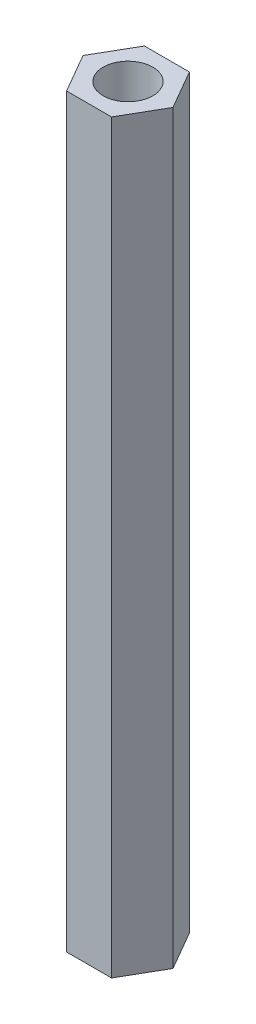
ISO-10303-21;
HEADER;
FILE_DESCRIPTION(('STEP AP214'),'2;1');
FILE_NAME('part.step','',(''),(''),'','','');
FILE_SCHEMA(('AUTOMOTIVE_DESIGN { 1 0 10303 214 1 1 1 1 }'));
ENDSEC;
DATA;
#1=APPLICATION_CONTEXT('core data for automotive mechanical design processes');
#2=APPLICATION_PROTOCOL_DEFINITION('international standard','automotive_design',2000,#1);
#3=PRODUCT_CONTEXT('',#1,'mechanical');
#4=PRODUCT('Part','Part','',(#3));
#5=PRODUCT_RELATED_PRODUCT_CATEGORY('part','',(#4));
#6=PRODUCT_DEFINITION_FORMATION('','',#4);
#7=PRODUCT_DEFINITION_CONTEXT('part definition',#1,'design');
#8=PRODUCT_DEFINITION('design','',#6,#7);
#9=PRODUCT_DEFINITION_SHAPE('','',#8);
#10=(LENGTH_UNIT() NAMED_UNIT(*) SI_UNIT(.MILLI.,.METRE.));
#11=(NAMED_UNIT(*) PLANE_ANGLE_UNIT() SI_UNIT($,.RADIAN.));
#12=(NAMED_UNIT(*) SI_UNIT($,.STERADIAN.) SOLID_ANGLE_UNIT());
#13=UNCERTAINTY_MEASURE_WITH_UNIT(LENGTH_MEASURE(1.E-05),#10,'distance_accuracy_value','');
#14=(GEOMETRIC_REPRESENTATION_CONTEXT(3) GLOBAL_UNCERTAINTY_ASSIGNED_CONTEXT((#13)) GLOBAL_UNIT_ASSIGNED_CONTEXT((#10,
#11,#12)) REPRESENTATION_CONTEXT('',''));
#15=CARTESIAN_POINT('',(0.,0.,0.));
#16=DIRECTION('',(0.,0.,1.));
#17=DIRECTION('',(1.,0.,0.));
#18=AXIS2_PLACEMENT_3D('',#15,#16,#17);
#19=CARTESIAN_POINT('',(0.,45.,0.));
#20=DIRECTION('',(0.,1.,0.));
#21=DIRECTION('',(0.,0.,1.));
#22=AXIS2_PLACEMENT_3D('',#19,#20,#21);
#23=PLANE('',#22);
#24=DIRECTION('',(0.499999999999995,0.,-0.866025403784442));
#25=VECTOR('',#24,1.);
#26=CARTESIAN_POINT('',(1.35677313259564,45.,2.34999999999997));
#27=LINE('',#26,#25);
#28=CARTESIAN_POINT('',(1.35677313259564,45.,2.34999999999997));
#29=VERTEX_POINT('',#28);
#30=CARTESIAN_POINT('',(2.71354626519123,45.,0.));
#31=VERTEX_POINT('',#30);
#32=EDGE_CURVE('E152',#29,#31,#27,.T.);
#33=ORIENTED_EDGE('',*,*,#32,.T.);
#34=DIRECTION('',(-0.500000000000001,0.,-0.866025403784438));
#35=VECTOR('',#34,1.);
#36=CARTESIAN_POINT('',(2.71354626519123,45.,0.));
#37=LINE('',#36,#35);
#38=CARTESIAN_POINT('',(1.35677313259561,45.,-2.34999999999999));
#39=VERTEX_POINT('',#38);
#40=EDGE_CURVE('E100',#31,#39,#37,.T.);
#41=ORIENTED_EDGE('',*,*,#40,.T.);
#42=DIRECTION('',(-1.,0.,0.));
#43=VECTOR('',#42,1.);
#44=CARTESIAN_POINT('',(1.35677313259561,45.,-2.34999999999999));
#45=LINE('',#44,#43);
#46=CARTESIAN_POINT('',(-1.35677313259562,45.,-2.34999999999998));
#47=VERTEX_POINT('',#46);
#48=EDGE_CURVE('E113',#39,#47,#45,.T.);
#49=ORIENTED_EDGE('',*,*,#48,.T.);
#50=DIRECTION('',(-0.499999999999995,0.,0.866025403784442));
#51=VECTOR('',#50,1.);
#52=CARTESIAN_POINT('',(-1.35677313259562,45.,-2.34999999999998));
#53=LINE('',#52,#51);
#54=CARTESIAN_POINT('',(-2.71354626519123,45.,0.));
#55=VERTEX_POINT('',#54);
#56=EDGE_CURVE('E107',#47,#55,#53,.T.);
#57=ORIENTED_EDGE('',*,*,#56,.T.);
#58=DIRECTION('',(0.500000000000007,0.,0.866025403784435));
#59=VECTOR('',#58,1.);
#60=CARTESIAN_POINT('',(-2.71354626519123,45.,0.));
#61=LINE('',#60,#59);
#62=CARTESIAN_POINT('',(-1.35677313259559,45.,2.35));
#63=VERTEX_POINT('',#62);
#64=EDGE_CURVE('E111',#55,#63,#61,.T.);
#65=ORIENTED_EDGE('',*,*,#64,.T.);
#66=DIRECTION('',(1.,0.,0.));
#67=VECTOR('',#66,1.);
#68=CARTESIAN_POINT('',(-1.35677313259559,45.,2.35));
#69=LINE('',#68,#67);
#70=EDGE_CURVE('E63',#63,#29,#69,.T.);
#71=ORIENTED_EDGE('',*,*,#70,.T.);
#72=EDGE_LOOP('',(#33,#41,#49,#57,#65,#71));
#73=FACE_BOUND('',#72,.T.);
#74=CARTESIAN_POINT('',(0.,45.,0.));
#75=DIRECTION('',(0.,1.,0.));
#76=DIRECTION('',(0.,0.,1.));
#77=AXIS2_PLACEMENT_3D('',#74,#75,#76);
#78=CIRCLE('',#77,1.5);
#79=CARTESIAN_POINT('',(0.,45.,-1.5));
#80=VERTEX_POINT('',#79);
#81=EDGE_CURVE('E140',#80,#80,#78,.T.);
#82=ORIENTED_EDGE('',*,*,#81,.F.);
#83=EDGE_LOOP('',(#82));
#84=FACE_BOUND('',#83,.T.);
#85=ADVANCED_FACE('F45',(#73,#84),#23,.T.);
#86=CARTESIAN_POINT('',(0.,0.,0.));
#87=DIRECTION('',(0.,1.,0.));
#88=DIRECTION('',(0.,0.,1.));
#89=AXIS2_PLACEMENT_3D('',#86,#87,#88);
#90=PLANE('',#89);
#91=DIRECTION('',(0.499999999999995,0.,-0.866025403784442));
#92=VECTOR('',#91,1.);
#93=CARTESIAN_POINT('',(1.35677313259564,0.,2.34999999999997));
#94=LINE('',#93,#92);
#95=CARTESIAN_POINT('',(1.35677313259564,0.,2.34999999999997));
#96=VERTEX_POINT('',#95);
#97=CARTESIAN_POINT('',(2.71354626519123,0.,0.));
#98=VERTEX_POINT('',#97);
#99=EDGE_CURVE('E135',#96,#98,#94,.T.);
#100=ORIENTED_EDGE('',*,*,#99,.F.);
#101=DIRECTION('',(1.,0.,0.));
#102=VECTOR('',#101,1.);
#103=CARTESIAN_POINT('',(-1.35677313259559,0.,2.35));
#104=LINE('',#103,#102);
#105=CARTESIAN_POINT('',(-1.35677313259559,0.,2.35));
#106=VERTEX_POINT('',#105);
#107=EDGE_CURVE('E92',#106,#96,#104,.T.);
#108=ORIENTED_EDGE('',*,*,#107,.F.);
#109=DIRECTION('',(0.500000000000007,0.,0.866025403784435));
#110=VECTOR('',#109,1.);
#111=CARTESIAN_POINT('',(-2.71354626519123,0.,0.));
#112=LINE('',#111,#110);
#113=CARTESIAN_POINT('',(-2.71354626519123,0.,0.));
#114=VERTEX_POINT('',#113);
#115=EDGE_CURVE('E86',#114,#106,#112,.T.);
#116=ORIENTED_EDGE('',*,*,#115,.F.);
#117=DIRECTION('',(-0.499999999999995,0.,0.866025403784442));
#118=VECTOR('',#117,1.);
#119=CARTESIAN_POINT('',(-1.35677313259562,0.,-2.34999999999998));
#120=LINE('',#119,#118);
#121=CARTESIAN_POINT('',(-1.35677313259562,0.,-2.34999999999998));
#122=VERTEX_POINT('',#121);
#123=EDGE_CURVE('E122',#122,#114,#120,.T.);
#124=ORIENTED_EDGE('',*,*,#123,.F.);
#125=DIRECTION('',(-1.,0.,0.));
#126=VECTOR('',#125,1.);
#127=CARTESIAN_POINT('',(1.35677313259561,0.,-2.34999999999999));
#128=LINE('',#127,#126);
#129=CARTESIAN_POINT('',(1.35677313259561,0.,-2.34999999999999));
#130=VERTEX_POINT('',#129);
#131=EDGE_CURVE('E143',#130,#122,#128,.T.);
#132=ORIENTED_EDGE('',*,*,#131,.F.);
#133=DIRECTION('',(-0.500000000000001,0.,-0.866025403784438));
#134=VECTOR('',#133,1.);
#135=CARTESIAN_POINT('',(2.71354626519123,0.,0.));
#136=LINE('',#135,#134);
#137=EDGE_CURVE('E139',#98,#130,#136,.T.);
#138=ORIENTED_EDGE('',*,*,#137,.F.);
#139=EDGE_LOOP('',(#100,#108,#116,#124,#132,#138));
#140=FACE_BOUND('',#139,.T.);
#141=CARTESIAN_POINT('',(0.,0.,0.));
#142=DIRECTION('',(0.,1.,0.));
#143=DIRECTION('',(0.,0.,1.));
#144=AXIS2_PLACEMENT_3D('',#141,#142,#143);
#145=CIRCLE('',#144,1.5);
#146=CARTESIAN_POINT('',(0.,0.,-1.5));
#147=VERTEX_POINT('',#146);
#148=EDGE_CURVE('E249',#147,#147,#145,.T.);
#149=ORIENTED_EDGE('',*,*,#148,.T.);
#150=EDGE_LOOP('',(#149));
#151=FACE_BOUND('',#150,.T.);
#152=ADVANCED_FACE('F165',(#140,#151),#90,.F.);
#153=CARTESIAN_POINT('',(1.35677313259564,45.,2.34999999999997));
#154=DIRECTION('',(-0.866025403784441,0.,-0.499999999999995));
#155=DIRECTION('',(-0.499999999999995,0.,0.866025403784442));
#156=AXIS2_PLACEMENT_3D('',#153,#154,#155);
#157=PLANE('',#156);
#158=ORIENTED_EDGE('',*,*,#99,.T.);
#159=DIRECTION('',(0.,-1.,0.));
#160=VECTOR('',#159,1.);
#161=CARTESIAN_POINT('',(2.71354626519123,45.,0.));
#162=LINE('',#161,#160);
#163=EDGE_CURVE('E11',#31,#98,#162,.T.);
#164=ORIENTED_EDGE('',*,*,#163,.F.);
#165=ORIENTED_EDGE('',*,*,#32,.F.);
#166=DIRECTION('',(0.,-1.,0.));
#167=VECTOR('',#166,1.);
#168=CARTESIAN_POINT('',(1.35677313259564,45.,2.34999999999997));
#169=LINE('',#168,#167);
#170=EDGE_CURVE('E131',#29,#96,#169,.T.);
#171=ORIENTED_EDGE('',*,*,#170,.T.);
#172=EDGE_LOOP('',(#158,#164,#165,#171));
#173=FACE_BOUND('',#172,.T.);
#174=ADVANCED_FACE('F47',(#173),#157,.F.);
#175=CARTESIAN_POINT('',(2.71354626519123,45.,0.));
#176=DIRECTION('',(-0.866025403784438,0.,0.500000000000001));
#177=DIRECTION('',(0.500000000000001,0.,0.866025403784438));
#178=AXIS2_PLACEMENT_3D('',#175,#176,#177);
#179=PLANE('',#178);
#180=ORIENTED_EDGE('',*,*,#137,.T.);
#181=DIRECTION('',(0.,-1.,0.));
#182=VECTOR('',#181,1.);
#183=CARTESIAN_POINT('',(1.35677313259561,45.,-2.34999999999999));
#184=LINE('',#183,#182);
#185=EDGE_CURVE('E55',#39,#130,#184,.T.);
#186=ORIENTED_EDGE('',*,*,#185,.F.);
#187=ORIENTED_EDGE('',*,*,#40,.F.);
#188=ORIENTED_EDGE('',*,*,#163,.T.);
#189=EDGE_LOOP('',(#180,#186,#187,#188));
#190=FACE_BOUND('',#189,.T.);
#191=ADVANCED_FACE('F190',(#190),#179,.F.);
#192=CARTESIAN_POINT('',(1.35677313259561,45.,-2.34999999999999));
#193=DIRECTION('',(0.,0.,1.));
#194=DIRECTION('',(1.,0.,0.));
#195=AXIS2_PLACEMENT_3D('',#192,#193,#194);
#196=PLANE('',#195);
#197=ORIENTED_EDGE('',*,*,#131,.T.);
#198=DIRECTION('',(0.,-1.,0.));
#199=VECTOR('',#198,1.);
#200=CARTESIAN_POINT('',(-1.35677313259562,45.,-2.34999999999998));
#201=LINE('',#200,#199);
#202=EDGE_CURVE('E124',#47,#122,#201,.T.);
#203=ORIENTED_EDGE('',*,*,#202,.F.);
#204=ORIENTED_EDGE('',*,*,#48,.F.);
#205=ORIENTED_EDGE('',*,*,#185,.T.);
#206=EDGE_LOOP('',(#197,#203,#204,#205));
#207=FACE_BOUND('',#206,.T.);
#208=ADVANCED_FACE('F162',(#207),#196,.F.);
#209=CARTESIAN_POINT('',(-1.35677313259562,45.,-2.34999999999998));
#210=DIRECTION('',(0.866025403784442,0.,0.499999999999995));
#211=DIRECTION('',(0.499999999999995,0.,-0.866025403784442));
#212=AXIS2_PLACEMENT_3D('',#209,#210,#211);
#213=PLANE('',#212);
#214=ORIENTED_EDGE('',*,*,#123,.T.);
#215=DIRECTION('',(0.,-1.,0.));
#216=VECTOR('',#215,1.);
#217=CARTESIAN_POINT('',(-2.71354626519123,45.,0.));
#218=LINE('',#217,#216);
#219=EDGE_CURVE('E119',#55,#114,#218,.T.);
#220=ORIENTED_EDGE('',*,*,#219,.F.);
#221=ORIENTED_EDGE('',*,*,#56,.F.);
#222=ORIENTED_EDGE('',*,*,#202,.T.);
#223=EDGE_LOOP('',(#214,#220,#221,#222));
#224=FACE_BOUND('',#223,.T.);
#225=ADVANCED_FACE('F120',(#224),#213,.F.);
#226=CARTESIAN_POINT('',(-2.71354626519123,45.,0.));
#227=DIRECTION('',(0.866025403784434,0.,-0.500000000000007));
#228=DIRECTION('',(-0.500000000000007,0.,-0.866025403784435));
#229=AXIS2_PLACEMENT_3D('',#226,#227,#228);
#230=PLANE('',#229);
#231=ORIENTED_EDGE('',*,*,#115,.T.);
#232=DIRECTION('',(0.,-1.,0.));
#233=VECTOR('',#232,1.);
#234=CARTESIAN_POINT('',(-1.35677313259559,45.,2.35));
#235=LINE('',#234,#233);
#236=EDGE_CURVE('E125',#63,#106,#235,.T.);
#237=ORIENTED_EDGE('',*,*,#236,.F.);
#238=ORIENTED_EDGE('',*,*,#64,.F.);
#239=ORIENTED_EDGE('',*,*,#219,.T.);
#240=EDGE_LOOP('',(#231,#237,#238,#239));
#241=FACE_BOUND('',#240,.T.);
#242=ADVANCED_FACE('F127',(#241),#230,.F.);
#243=CARTESIAN_POINT('',(-1.35677313259559,45.,2.35));
#244=DIRECTION('',(0.,0.,-1.));
#245=DIRECTION('',(-1.,0.,0.));
#246=AXIS2_PLACEMENT_3D('',#243,#244,#245);
#247=PLANE('',#246);
#248=ORIENTED_EDGE('',*,*,#107,.T.);
#249=ORIENTED_EDGE('',*,*,#170,.F.);
#250=ORIENTED_EDGE('',*,*,#70,.F.);
#251=ORIENTED_EDGE('',*,*,#236,.T.);
#252=EDGE_LOOP('',(#248,#249,#250,#251));
#253=FACE_BOUND('',#252,.T.);
#254=ADVANCED_FACE('F170',(#253),#247,.F.);
#255=CARTESIAN_POINT('',(0.,45.,0.));
#256=DIRECTION('',(0.,-1.,0.));
#257=DIRECTION('',(0.,0.,-1.));
#258=AXIS2_PLACEMENT_3D('',#255,#256,#257);
#259=CYLINDRICAL_SURFACE('',#258,1.5);
#260=CARTESIAN_POINT('',(0.,45.,-1.5));
#261=CARTESIAN_POINT('',(0.,44.53125,-1.5));
#262=CARTESIAN_POINT('',(0.,44.0625,-1.5));
#263=CARTESIAN_POINT('',(0.,43.125,-1.5));
#264=CARTESIAN_POINT('',(0.,42.65625,-1.5));
#265=CARTESIAN_POINT('',(0.,41.71875,-1.5));
#266=CARTESIAN_POINT('',(0.,41.25,-1.5));
#267=CARTESIAN_POINT('',(0.,40.3125,-1.5));
#268=CARTESIAN_POINT('',(0.,39.84375,-1.5));
#269=CARTESIAN_POINT('',(0.,38.90625,-1.5));
#270=CARTESIAN_POINT('',(0.,38.4375,-1.5));
#271=CARTESIAN_POINT('',(0.,37.5,-1.5));
#272=CARTESIAN_POINT('',(0.,37.03125,-1.5));
#273=CARTESIAN_POINT('',(0.,36.09375,-1.5));
#274=CARTESIAN_POINT('',(0.,35.625,-1.5));
#275=CARTESIAN_POINT('',(0.,34.6875,-1.5));
#276=CARTESIAN_POINT('',(0.,34.21875,-1.5));
#277=CARTESIAN_POINT('',(0.,33.28125,-1.5));
#278=CARTESIAN_POINT('',(0.,32.8125,-1.5));
#279=CARTESIAN_POINT('',(0.,31.875,-1.5));
#280=CARTESIAN_POINT('',(0.,31.40625,-1.5));
#281=CARTESIAN_POINT('',(0.,30.46875,-1.5));
#282=CARTESIAN_POINT('',(0.,30.,-1.5));
#283=CARTESIAN_POINT('',(0.,29.0625,-1.5));
#284=CARTESIAN_POINT('',(0.,28.59375,-1.5));
#285=CARTESIAN_POINT('',(0.,27.65625,-1.5));
#286=CARTESIAN_POINT('',(0.,27.1875,-1.5));
#287=CARTESIAN_POINT('',(0.,26.25,-1.5));
#288=CARTESIAN_POINT('',(0.,25.78125,-1.5));
#289=CARTESIAN_POINT('',(0.,24.84375,-1.5));
#290=CARTESIAN_POINT('',(0.,24.375,-1.5));
#291=CARTESIAN_POINT('',(0.,23.4375,-1.5));
#292=CARTESIAN_POINT('',(0.,22.96875,-1.5));
#293=CARTESIAN_POINT('',(0.,22.03125,-1.5));
#294=CARTESIAN_POINT('',(0.,21.5625,-1.5));
#295=CARTESIAN_POINT('',(0.,20.625,-1.5));
#296=CARTESIAN_POINT('',(0.,20.15625,-1.5));
#297=CARTESIAN_POINT('',(0.,19.21875,-1.5));
#298=CARTESIAN_POINT('',(0.,18.75,-1.5));
#299=CARTESIAN_POINT('',(0.,17.8125,-1.5));
#300=CARTESIAN_POINT('',(0.,17.34375,-1.5));
#301=CARTESIAN_POINT('',(0.,16.40625,-1.5));
#302=CARTESIAN_POINT('',(0.,15.9375,-1.5));
#303=CARTESIAN_POINT('',(0.,15.,-1.5));
#304=CARTESIAN_POINT('',(0.,14.53125,-1.5));
#305=CARTESIAN_POINT('',(0.,13.59375,-1.5));
#306=CARTESIAN_POINT('',(0.,13.125,-1.5));
#307=CARTESIAN_POINT('',(0.,12.1875,-1.5));
#308=CARTESIAN_POINT('',(0.,11.71875,-1.5));
#309=CARTESIAN_POINT('',(0.,10.78125,-1.5));
#310=CARTESIAN_POINT('',(0.,10.3125,-1.5));
#311=CARTESIAN_POINT('',(0.,9.37499999999999,-1.5));
#312=CARTESIAN_POINT('',(0.,8.90624999999999,-1.5));
#313=CARTESIAN_POINT('',(0.,7.96874999999999,-1.5));
#314=CARTESIAN_POINT('',(0.,7.5,-1.5));
#315=CARTESIAN_POINT('',(0.,6.56249999999999,-1.5));
#316=CARTESIAN_POINT('',(0.,6.09374999999999,-1.5));
#317=CARTESIAN_POINT('',(0.,5.15624999999999,-1.5));
#318=CARTESIAN_POINT('',(0.,4.68749999999999,-1.5));
#319=CARTESIAN_POINT('',(0.,3.74999999999999,-1.5));
#320=CARTESIAN_POINT('',(0.,3.28124999999999,-1.5));
#321=CARTESIAN_POINT('',(0.,2.34374999999999,-1.5));
#322=CARTESIAN_POINT('',(0.,1.87499999999999,-1.5));
#323=CARTESIAN_POINT('',(0.,0.937499999999992,-1.5));
#324=CARTESIAN_POINT('',(0.,0.468749999999993,-1.5));
#325=CARTESIAN_POINT('',(0.,0.,-1.5));
#326=B_SPLINE_CURVE_WITH_KNOTS('',3,(#260,#261,#262,#263,#264,#265,#266,#267,#268,#269,#270,
#271,#272,#273,#274,#275,#276,#277,#278,#279,#280,#281,#282,#283,#284,#285,#286,#287,#288,#289,
#290,#291,#292,#293,#294,#295,#296,#297,#298,#299,#300,#301,#302,#303,#304,#305,#306,#307,#308,
#309,#310,#311,#312,#313,#314,#315,#316,#317,#318,#319,#320,#321,#322,#323,#324,#325),
.UNSPECIFIED.,.F.,.F.,(4,2,2,2,2,2,2,2,2,2,2,2,2,2,2,2,2,2,2,2,2,2,2,2,2,2,2,2,2,2,2,2,4),(0.,
1.40625,2.8125,4.21874999999999,5.625,7.03125,8.43749999999999,9.84375,11.25,12.65625,14.0625,
15.46875,16.875,18.28125,19.6875,21.09375,22.5,23.90625,25.3125,26.71875,28.125,29.53125,
30.9375,32.34375,33.75,35.15625,36.5625,37.96875,39.375,40.78125,42.1875,43.59375,45.),.UNSPECIFIED.);
#327=EDGE_CURVE('BSEAM172',#80,#147,#326,.T.);
#328=ORIENTED_EDGE('',*,*,#81,.T.);
#329=ORIENTED_EDGE('',*,*,#148,.F.);
#330=ORIENTED_EDGE('',*,*,#327,.T.);
#331=ORIENTED_EDGE('',*,*,#327,.F.);
#332=EDGE_LOOP('',(#328,#330,#329,#331));
#333=FACE_BOUND('',#332,.T.);
#334=ADVANCED_FACE('F172',(#333),#259,.F.);
#335=CLOSED_SHELL('',(#85,#152,#174,#191,#208,#225,#242,#254,#334));
#336=MANIFOLD_SOLID_BREP('B2',#335);
#337=ADVANCED_BREP_SHAPE_REPRESENTATION('',(#18,#336),#14);
#338=SHAPE_DEFINITION_REPRESENTATION(#9,#337);
ENDSEC;
END-ISO-10303-21;
